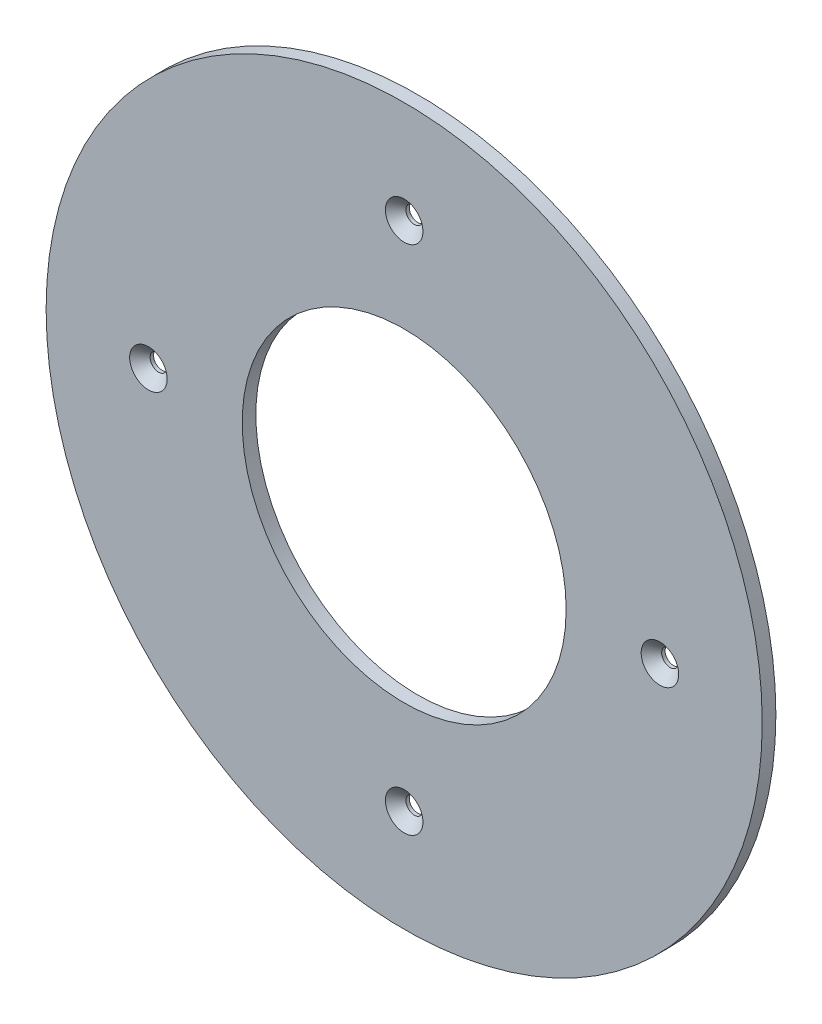
ISO-10303-21;
HEADER;
FILE_DESCRIPTION(('STEP AP214'),'2;1');
FILE_NAME('part.step','',(''),(''),'','','');
FILE_SCHEMA(('AUTOMOTIVE_DESIGN { 1 0 10303 214 1 1 1 1 }'));
ENDSEC;
DATA;
#1=APPLICATION_CONTEXT('core data for automotive mechanical design processes');
#2=APPLICATION_PROTOCOL_DEFINITION('international standard','automotive_design',2000,#1);
#3=PRODUCT_CONTEXT('',#1,'mechanical');
#4=PRODUCT('Part','Part','',(#3));
#5=PRODUCT_RELATED_PRODUCT_CATEGORY('part','',(#4));
#6=PRODUCT_DEFINITION_FORMATION('','',#4);
#7=PRODUCT_DEFINITION_CONTEXT('part definition',#1,'design');
#8=PRODUCT_DEFINITION('design','',#6,#7);
#9=PRODUCT_DEFINITION_SHAPE('','',#8);
#10=(LENGTH_UNIT() NAMED_UNIT(*) SI_UNIT(.MILLI.,.METRE.));
#11=(NAMED_UNIT(*) PLANE_ANGLE_UNIT() SI_UNIT($,.RADIAN.));
#12=(NAMED_UNIT(*) SI_UNIT($,.STERADIAN.) SOLID_ANGLE_UNIT());
#13=UNCERTAINTY_MEASURE_WITH_UNIT(LENGTH_MEASURE(1.E-05),#10,'distance_accuracy_value','');
#14=(GEOMETRIC_REPRESENTATION_CONTEXT(3) GLOBAL_UNCERTAINTY_ASSIGNED_CONTEXT((#13)) GLOBAL_UNIT_ASSIGNED_CONTEXT((#10,
#11,#12)) REPRESENTATION_CONTEXT('',''));
#15=CARTESIAN_POINT('',(0.,0.,0.));
#16=DIRECTION('',(0.,0.,1.));
#17=DIRECTION('',(1.,0.,0.));
#18=AXIS2_PLACEMENT_3D('',#15,#16,#17);
#19=CARTESIAN_POINT('',(0.,0.,4.));
#20=DIRECTION('',(0.,0.,1.));
#21=DIRECTION('',(1.,0.,0.));
#22=AXIS2_PLACEMENT_3D('',#19,#20,#21);
#23=PLANE('',#22);
#24=CARTESIAN_POINT('',(-75.,0.,4.));
#25=DIRECTION('',(0.,0.,1.));
#26=DIRECTION('',(1.,0.,0.));
#27=AXIS2_PLACEMENT_3D('',#24,#25,#26);
#28=CIRCLE('',#27,5.50000000000001);
#29=CARTESIAN_POINT('',(-69.5,0.,4.));
#30=VERTEX_POINT('',#29);
#31=EDGE_CURVE('E52',#30,#30,#28,.F.);
#32=ORIENTED_EDGE('',*,*,#31,.T.);
#33=EDGE_LOOP('',(#32));
#34=FACE_BOUND('',#33,.T.);
#35=CARTESIAN_POINT('',(0.,-75.,4.));
#36=DIRECTION('',(0.,0.,1.));
#37=DIRECTION('',(1.,0.,0.));
#38=AXIS2_PLACEMENT_3D('',#35,#36,#37);
#39=CIRCLE('',#38,5.50000000000009);
#40=CARTESIAN_POINT('',(5.50000000000009,-75.,4.));
#41=VERTEX_POINT('',#40);
#42=EDGE_CURVE('E57',#41,#41,#39,.F.);
#43=ORIENTED_EDGE('',*,*,#42,.T.);
#44=EDGE_LOOP('',(#43));
#45=FACE_BOUND('',#44,.T.);
#46=CARTESIAN_POINT('',(75.,0.,4.));
#47=DIRECTION('',(0.,0.,1.));
#48=DIRECTION('',(1.,0.,0.));
#49=AXIS2_PLACEMENT_3D('',#46,#47,#48);
#50=CIRCLE('',#49,5.50000000000001);
#51=CARTESIAN_POINT('',(80.5,0.,4.));
#52=VERTEX_POINT('',#51);
#53=EDGE_CURVE('E60',#52,#52,#50,.F.);
#54=ORIENTED_EDGE('',*,*,#53,.T.);
#55=EDGE_LOOP('',(#54));
#56=FACE_BOUND('',#55,.T.);
#57=CARTESIAN_POINT('',(0.,75.,4.));
#58=DIRECTION('',(0.,0.,1.));
#59=DIRECTION('',(1.,0.,0.));
#60=AXIS2_PLACEMENT_3D('',#57,#58,#59);
#61=CIRCLE('',#60,5.50000000000009);
#62=CARTESIAN_POINT('',(5.50000000000009,75.,4.));
#63=VERTEX_POINT('',#62);
#64=EDGE_CURVE('E63',#63,#63,#61,.F.);
#65=ORIENTED_EDGE('',*,*,#64,.T.);
#66=EDGE_LOOP('',(#65));
#67=FACE_BOUND('',#66,.T.);
#68=CARTESIAN_POINT('',(0.,0.,4.));
#69=DIRECTION('',(0.,0.,1.));
#70=DIRECTION('',(1.,0.,0.));
#71=AXIS2_PLACEMENT_3D('',#68,#69,#70);
#72=CIRCLE('',#71,105.);
#73=CARTESIAN_POINT('',(105.,0.,4.));
#74=VERTEX_POINT('',#73);
#75=EDGE_CURVE('E69',#74,#74,#72,.T.);
#76=ORIENTED_EDGE('',*,*,#75,.T.);
#77=EDGE_LOOP('',(#76));
#78=FACE_BOUND('',#77,.T.);
#79=CARTESIAN_POINT('',(0.,0.,4.));
#80=DIRECTION('',(0.,0.,1.));
#81=DIRECTION('',(1.,0.,0.));
#82=AXIS2_PLACEMENT_3D('',#79,#80,#81);
#83=CIRCLE('',#82,47.5);
#84=CARTESIAN_POINT('',(47.5,0.,4.));
#85=VERTEX_POINT('',#84);
#86=EDGE_CURVE('E73',#85,#85,#83,.T.);
#87=ORIENTED_EDGE('',*,*,#86,.F.);
#88=EDGE_LOOP('',(#87));
#89=FACE_BOUND('',#88,.T.);
#90=ADVANCED_FACE('F37',(#34,#45,#56,#67,#78,#89),#23,.T.);
#91=CARTESIAN_POINT('',(0.,0.,0.));
#92=DIRECTION('',(0.,0.,1.));
#93=DIRECTION('',(1.,0.,0.));
#94=AXIS2_PLACEMENT_3D('',#91,#92,#93);
#95=PLANE('',#94);
#96=CARTESIAN_POINT('',(0.,0.,0.));
#97=DIRECTION('',(0.,0.,1.));
#98=DIRECTION('',(1.,0.,0.));
#99=AXIS2_PLACEMENT_3D('',#96,#97,#98);
#100=CIRCLE('',#99,105.);
#101=CARTESIAN_POINT('',(105.,0.,0.));
#102=VERTEX_POINT('',#101);
#103=EDGE_CURVE('E70',#102,#102,#100,.T.);
#104=ORIENTED_EDGE('',*,*,#103,.F.);
#105=EDGE_LOOP('',(#104));
#106=FACE_BOUND('',#105,.T.);
#107=CARTESIAN_POINT('',(0.,0.,0.));
#108=DIRECTION('',(0.,0.,1.));
#109=DIRECTION('',(1.,0.,0.));
#110=AXIS2_PLACEMENT_3D('',#107,#108,#109);
#111=CIRCLE('',#110,47.5);
#112=CARTESIAN_POINT('',(47.5,0.,0.));
#113=VERTEX_POINT('',#112);
#114=EDGE_CURVE('E76',#113,#113,#111,.T.);
#115=ORIENTED_EDGE('',*,*,#114,.T.);
#116=EDGE_LOOP('',(#115));
#117=FACE_BOUND('',#116,.T.);
#118=CARTESIAN_POINT('',(0.,75.,0.));
#119=DIRECTION('',(0.,0.,1.));
#120=DIRECTION('',(1.,0.,0.));
#121=AXIS2_PLACEMENT_3D('',#118,#119,#120);
#122=CIRCLE('',#121,2.5);
#123=CARTESIAN_POINT('',(2.5,75.,0.));
#124=VERTEX_POINT('',#123);
#125=EDGE_CURVE('E79',#124,#124,#122,.T.);
#126=ORIENTED_EDGE('',*,*,#125,.T.);
#127=EDGE_LOOP('',(#126));
#128=FACE_BOUND('',#127,.T.);
#129=CARTESIAN_POINT('',(75.,0.,0.));
#130=DIRECTION('',(0.,0.,1.));
#131=DIRECTION('',(1.,0.,0.));
#132=AXIS2_PLACEMENT_3D('',#129,#130,#131);
#133=CIRCLE('',#132,2.49999999999999);
#134=CARTESIAN_POINT('',(77.5,0.,0.));
#135=VERTEX_POINT('',#134);
#136=EDGE_CURVE('E84',#135,#135,#133,.T.);
#137=ORIENTED_EDGE('',*,*,#136,.T.);
#138=EDGE_LOOP('',(#137));
#139=FACE_BOUND('',#138,.T.);
#140=CARTESIAN_POINT('',(0.,-75.,0.));
#141=DIRECTION('',(0.,0.,1.));
#142=DIRECTION('',(1.,0.,0.));
#143=AXIS2_PLACEMENT_3D('',#140,#141,#142);
#144=CIRCLE('',#143,2.5);
#145=CARTESIAN_POINT('',(2.5,-75.,0.));
#146=VERTEX_POINT('',#145);
#147=EDGE_CURVE('E87',#146,#146,#144,.T.);
#148=ORIENTED_EDGE('',*,*,#147,.T.);
#149=EDGE_LOOP('',(#148));
#150=FACE_BOUND('',#149,.T.);
#151=CARTESIAN_POINT('',(-75.,0.,0.));
#152=DIRECTION('',(0.,0.,1.));
#153=DIRECTION('',(1.,0.,0.));
#154=AXIS2_PLACEMENT_3D('',#151,#152,#153);
#155=CIRCLE('',#154,2.49999999999999);
#156=CARTESIAN_POINT('',(-72.5,0.,0.));
#157=VERTEX_POINT('',#156);
#158=EDGE_CURVE('E90',#157,#157,#155,.T.);
#159=ORIENTED_EDGE('',*,*,#158,.T.);
#160=EDGE_LOOP('',(#159));
#161=FACE_BOUND('',#160,.T.);
#162=ADVANCED_FACE('F94',(#106,#117,#128,#139,#150,#161),#95,.F.);
#163=CARTESIAN_POINT('',(0.,0.,4.));
#164=DIRECTION('',(0.,0.,-1.));
#165=DIRECTION('',(-1.,0.,0.));
#166=AXIS2_PLACEMENT_3D('',#163,#164,#165);
#167=CYLINDRICAL_SURFACE('',#166,105.);
#168=ORIENTED_EDGE('',*,*,#75,.F.);
#169=EDGE_LOOP('',(#168));
#170=FACE_BOUND('',#169,.T.);
#171=ORIENTED_EDGE('',*,*,#103,.T.);
#172=EDGE_LOOP('',(#171));
#173=FACE_BOUND('',#172,.T.);
#174=ADVANCED_FACE('F118',(#170,#173),#167,.T.);
#175=CARTESIAN_POINT('',(0.,0.,4.));
#176=DIRECTION('',(0.,0.,-1.));
#177=DIRECTION('',(-1.,0.,0.));
#178=AXIS2_PLACEMENT_3D('',#175,#176,#177);
#179=CYLINDRICAL_SURFACE('',#178,47.5);
#180=ORIENTED_EDGE('',*,*,#86,.T.);
#181=EDGE_LOOP('',(#180));
#182=FACE_BOUND('',#181,.T.);
#183=ORIENTED_EDGE('',*,*,#114,.F.);
#184=EDGE_LOOP('',(#183));
#185=FACE_BOUND('',#184,.T.);
#186=ADVANCED_FACE('F123',(#182,#185),#179,.F.);
#187=CARTESIAN_POINT('',(0.,75.,4.));
#188=DIRECTION('',(0.,0.,-1.));
#189=DIRECTION('',(-1.,0.,0.));
#190=AXIS2_PLACEMENT_3D('',#187,#188,#189);
#191=CYLINDRICAL_SURFACE('',#190,2.5);
#192=CARTESIAN_POINT('',(0.,75.,0.999999999999906));
#193=DIRECTION('',(0.,0.,1.));
#194=DIRECTION('',(1.,0.,0.));
#195=AXIS2_PLACEMENT_3D('',#192,#193,#194);
#196=CIRCLE('',#195,2.5);
#197=CARTESIAN_POINT('',(2.5,75.,0.999999999999906));
#198=VERTEX_POINT('',#197);
#199=EDGE_CURVE('E10',#198,#198,#196,.T.);
#200=ORIENTED_EDGE('',*,*,#199,.T.);
#201=EDGE_LOOP('',(#200));
#202=FACE_BOUND('',#201,.T.);
#203=ORIENTED_EDGE('',*,*,#125,.F.);
#204=EDGE_LOOP('',(#203));
#205=FACE_BOUND('',#204,.T.);
#206=ADVANCED_FACE('F150',(#202,#205),#191,.F.);
#207=CARTESIAN_POINT('',(75.,0.,4.));
#208=DIRECTION('',(0.,0.,-1.));
#209=DIRECTION('',(-1.,0.,0.));
#210=AXIS2_PLACEMENT_3D('',#207,#208,#209);
#211=CYLINDRICAL_SURFACE('',#210,2.49999999999999);
#212=CARTESIAN_POINT('',(75.,0.,0.99999999999998));
#213=DIRECTION('',(0.,0.,1.));
#214=DIRECTION('',(1.,0.,0.));
#215=AXIS2_PLACEMENT_3D('',#212,#213,#214);
#216=CIRCLE('',#215,2.49999999999999);
#217=CARTESIAN_POINT('',(77.5,0.,0.99999999999998));
#218=VERTEX_POINT('',#217);
#219=EDGE_CURVE('E44',#218,#218,#216,.T.);
#220=ORIENTED_EDGE('',*,*,#219,.T.);
#221=EDGE_LOOP('',(#220));
#222=FACE_BOUND('',#221,.T.);
#223=ORIENTED_EDGE('',*,*,#136,.F.);
#224=EDGE_LOOP('',(#223));
#225=FACE_BOUND('',#224,.T.);
#226=ADVANCED_FACE('F109',(#222,#225),#211,.F.);
#227=CARTESIAN_POINT('',(0.,-75.,4.));
#228=DIRECTION('',(0.,0.,-1.));
#229=DIRECTION('',(-1.,0.,0.));
#230=AXIS2_PLACEMENT_3D('',#227,#228,#229);
#231=CYLINDRICAL_SURFACE('',#230,2.5);
#232=CARTESIAN_POINT('',(0.,-75.,0.999999999999906));
#233=DIRECTION('',(0.,0.,1.));
#234=DIRECTION('',(1.,0.,0.));
#235=AXIS2_PLACEMENT_3D('',#232,#233,#234);
#236=CIRCLE('',#235,2.5);
#237=CARTESIAN_POINT('',(2.5,-75.,0.999999999999906));
#238=VERTEX_POINT('',#237);
#239=EDGE_CURVE('E48',#238,#238,#236,.T.);
#240=ORIENTED_EDGE('',*,*,#239,.T.);
#241=EDGE_LOOP('',(#240));
#242=FACE_BOUND('',#241,.T.);
#243=ORIENTED_EDGE('',*,*,#147,.F.);
#244=EDGE_LOOP('',(#243));
#245=FACE_BOUND('',#244,.T.);
#246=ADVANCED_FACE('F99',(#242,#245),#231,.F.);
#247=CARTESIAN_POINT('',(-75.,0.,4.));
#248=DIRECTION('',(0.,0.,-1.));
#249=DIRECTION('',(-1.,0.,0.));
#250=AXIS2_PLACEMENT_3D('',#247,#248,#249);
#251=CYLINDRICAL_SURFACE('',#250,2.49999999999999);
#252=CARTESIAN_POINT('',(-75.,0.,0.99999999999998));
#253=DIRECTION('',(0.,0.,1.));
#254=DIRECTION('',(1.,0.,0.));
#255=AXIS2_PLACEMENT_3D('',#252,#253,#254);
#256=CIRCLE('',#255,2.49999999999999);
#257=CARTESIAN_POINT('',(-72.5,0.,0.99999999999998));
#258=VERTEX_POINT('',#257);
#259=EDGE_CURVE('E66',#258,#258,#256,.T.);
#260=ORIENTED_EDGE('',*,*,#259,.T.);
#261=EDGE_LOOP('',(#260));
#262=FACE_BOUND('',#261,.T.);
#263=ORIENTED_EDGE('',*,*,#158,.F.);
#264=EDGE_LOOP('',(#263));
#265=FACE_BOUND('',#264,.T.);
#266=ADVANCED_FACE('F96',(#262,#265),#251,.F.);
#267=CARTESIAN_POINT('',(-75.,0.,0.99999999999998));
#268=DIRECTION('',(0.,0.,1.));
#269=DIRECTION('',(1.,0.,0.));
#270=AXIS2_PLACEMENT_3D('',#267,#268,#269);
#271=CONICAL_SURFACE('',#270,2.49999999999999,0.785398163397447);
#272=ORIENTED_EDGE('',*,*,#31,.F.);
#273=EDGE_LOOP('',(#272));
#274=FACE_BOUND('',#273,.T.);
#275=ORIENTED_EDGE('',*,*,#259,.F.);
#276=EDGE_LOOP('',(#275));
#277=FACE_BOUND('',#276,.T.);
#278=ADVANCED_FACE('F98',(#274,#277),#271,.F.);
#279=CARTESIAN_POINT('',(0.,-75.,0.999999999999906));
#280=DIRECTION('',(0.,0.,1.));
#281=DIRECTION('',(1.,0.,0.));
#282=AXIS2_PLACEMENT_3D('',#279,#280,#281);
#283=CONICAL_SURFACE('',#282,2.5,0.785398163397447);
#284=ORIENTED_EDGE('',*,*,#42,.F.);
#285=EDGE_LOOP('',(#284));
#286=FACE_BOUND('',#285,.T.);
#287=ORIENTED_EDGE('',*,*,#239,.F.);
#288=EDGE_LOOP('',(#287));
#289=FACE_BOUND('',#288,.T.);
#290=ADVANCED_FACE('F106',(#286,#289),#283,.F.);
#291=CARTESIAN_POINT('',(75.,0.,0.99999999999998));
#292=DIRECTION('',(0.,0.,1.));
#293=DIRECTION('',(1.,0.,0.));
#294=AXIS2_PLACEMENT_3D('',#291,#292,#293);
#295=CONICAL_SURFACE('',#294,2.49999999999999,0.785398163397447);
#296=ORIENTED_EDGE('',*,*,#53,.F.);
#297=EDGE_LOOP('',(#296));
#298=FACE_BOUND('',#297,.T.);
#299=ORIENTED_EDGE('',*,*,#219,.F.);
#300=EDGE_LOOP('',(#299));
#301=FACE_BOUND('',#300,.T.);
#302=ADVANCED_FACE('F130',(#298,#301),#295,.F.);
#303=CARTESIAN_POINT('',(0.,75.,0.999999999999906));
#304=DIRECTION('',(0.,0.,1.));
#305=DIRECTION('',(1.,0.,0.));
#306=AXIS2_PLACEMENT_3D('',#303,#304,#305);
#307=CONICAL_SURFACE('',#306,2.5,0.785398163397447);
#308=ORIENTED_EDGE('',*,*,#64,.F.);
#309=EDGE_LOOP('',(#308));
#310=FACE_BOUND('',#309,.T.);
#311=ORIENTED_EDGE('',*,*,#199,.F.);
#312=EDGE_LOOP('',(#311));
#313=FACE_BOUND('',#312,.T.);
#314=ADVANCED_FACE('F39',(#310,#313),#307,.F.);
#315=CLOSED_SHELL('',(#90,#162,#174,#186,#206,#226,#246,#266,#278,#290,#302,#314));
#316=MANIFOLD_SOLID_BREP('B2',#315);
#317=ADVANCED_BREP_SHAPE_REPRESENTATION('',(#18,#316),#14);
#318=SHAPE_DEFINITION_REPRESENTATION(#9,#317);
ENDSEC;
END-ISO-10303-21;
